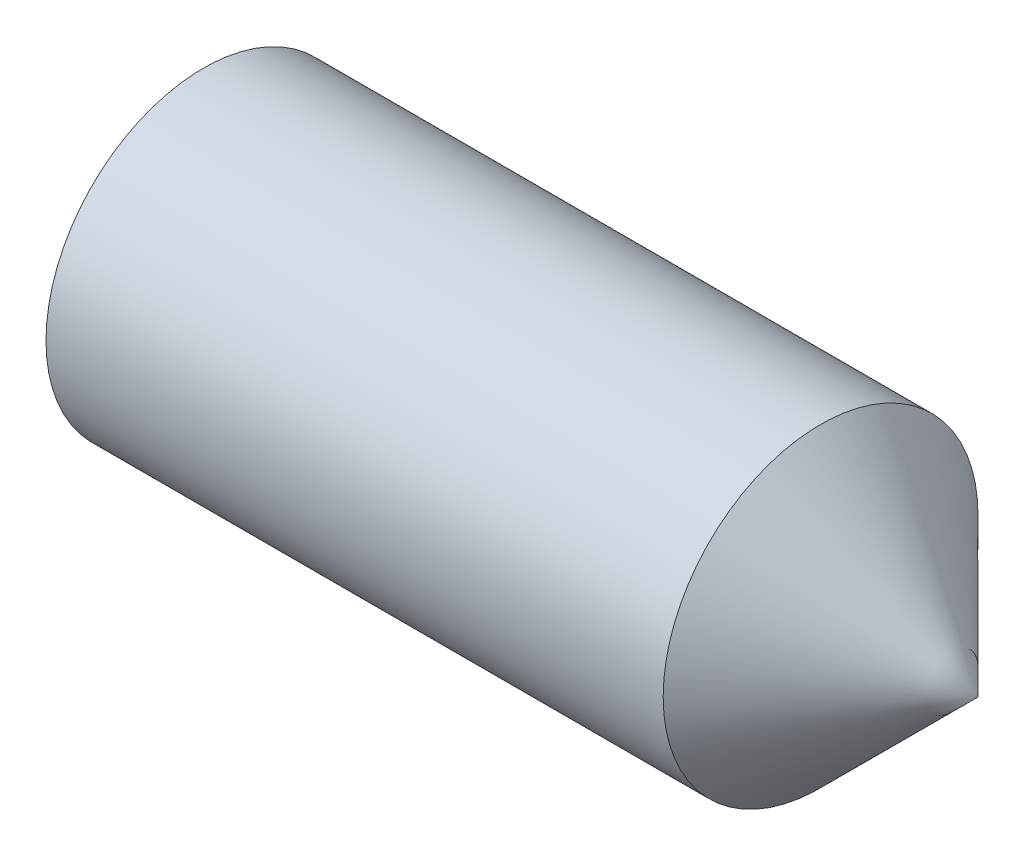
ISO-10303-21;
HEADER;
FILE_DESCRIPTION(('STEP AP214'),'2;1');
FILE_NAME('part.step','',(''),(''),'','','');
FILE_SCHEMA(('AUTOMOTIVE_DESIGN { 1 0 10303 214 1 1 1 1 }'));
ENDSEC;
DATA;
#1=APPLICATION_CONTEXT('core data for automotive mechanical design processes');
#2=APPLICATION_PROTOCOL_DEFINITION('international standard','automotive_design',2000,#1);
#3=PRODUCT_CONTEXT('',#1,'mechanical');
#4=PRODUCT('Part','Part','',(#3));
#5=PRODUCT_RELATED_PRODUCT_CATEGORY('part','',(#4));
#6=PRODUCT_DEFINITION_FORMATION('','',#4);
#7=PRODUCT_DEFINITION_CONTEXT('part definition',#1,'design');
#8=PRODUCT_DEFINITION('design','',#6,#7);
#9=PRODUCT_DEFINITION_SHAPE('','',#8);
#10=(LENGTH_UNIT() NAMED_UNIT(*) SI_UNIT(.MILLI.,.METRE.));
#11=(NAMED_UNIT(*) PLANE_ANGLE_UNIT() SI_UNIT($,.RADIAN.));
#12=(NAMED_UNIT(*) SI_UNIT($,.STERADIAN.) SOLID_ANGLE_UNIT());
#13=UNCERTAINTY_MEASURE_WITH_UNIT(LENGTH_MEASURE(1.E-05),#10,'distance_accuracy_value','');
#14=(GEOMETRIC_REPRESENTATION_CONTEXT(3) GLOBAL_UNCERTAINTY_ASSIGNED_CONTEXT((#13)) GLOBAL_UNIT_ASSIGNED_CONTEXT((#10,
#11,#12)) REPRESENTATION_CONTEXT('',''));
#15=CARTESIAN_POINT('',(0.,0.,0.));
#16=DIRECTION('',(0.,0.,1.));
#17=DIRECTION('',(1.,0.,0.));
#18=AXIS2_PLACEMENT_3D('',#15,#16,#17);
#19=CARTESIAN_POINT('',(0.,0.,0.));
#20=DIRECTION('',(-1.,0.,0.));
#21=DIRECTION('',(0.,0.,1.));
#22=AXIS2_PLACEMENT_3D('',#19,#20,#21);
#23=PLANE('',#22);
#24=CARTESIAN_POINT('',(0.,0.,0.));
#25=DIRECTION('',(-1.,0.,0.));
#26=DIRECTION('',(0.,0.,1.));
#27=AXIS2_PLACEMENT_3D('',#24,#25,#26);
#28=CIRCLE('',#27,10.352);
#29=CARTESIAN_POINT('',(0.,0.,10.352));
#30=VERTEX_POINT('',#29);
#31=EDGE_CURVE('E11',#30,#30,#28,.T.);
#32=ORIENTED_EDGE('',*,*,#31,.T.);
#33=EDGE_LOOP('',(#32));
#34=FACE_BOUND('',#33,.T.);
#35=DIRECTION('',(0.,0.,-1.));
#36=VECTOR('',#35,1.);
#37=CARTESIAN_POINT('',(0.,6.,3.46410161513774));
#38=LINE('',#37,#36);
#39=CARTESIAN_POINT('',(0.,6.,3.46410161513774));
#40=VERTEX_POINT('',#39);
#41=CARTESIAN_POINT('',(0.,6.,-3.46410161513776));
#42=VERTEX_POINT('',#41);
#43=EDGE_CURVE('E96',#40,#42,#38,.T.);
#44=ORIENTED_EDGE('',*,*,#43,.F.);
#45=DIRECTION('',(0.,-0.866025403784438,0.5));
#46=VECTOR('',#45,1.);
#47=CARTESIAN_POINT('',(0.,6.,3.46410161513774));
#48=LINE('',#47,#46);
#49=CARTESIAN_POINT('',(0.,0.,6.9282032302755));
#50=VERTEX_POINT('',#49);
#51=EDGE_CURVE('E49',#40,#50,#48,.T.);
#52=ORIENTED_EDGE('',*,*,#51,.T.);
#53=DIRECTION('',(0.,0.866025403784439,0.5));
#54=VECTOR('',#53,1.);
#55=CARTESIAN_POINT('',(0.,-5.99999999999999,3.46410161513775));
#56=LINE('',#55,#54);
#57=CARTESIAN_POINT('',(0.,-5.99999999999999,3.46410161513775));
#58=VERTEX_POINT('',#57);
#59=EDGE_CURVE('E102',#58,#50,#56,.T.);
#60=ORIENTED_EDGE('',*,*,#59,.F.);
#61=DIRECTION('',(0.,0.,-1.));
#62=VECTOR('',#61,1.);
#63=CARTESIAN_POINT('',(0.,-5.99999999999999,3.46410161513775));
#64=LINE('',#63,#62);
#65=CARTESIAN_POINT('',(0.,-5.99999999999999,-3.46410161513775));
#66=VERTEX_POINT('',#65);
#67=EDGE_CURVE('E122',#58,#66,#64,.T.);
#68=ORIENTED_EDGE('',*,*,#67,.T.);
#69=DIRECTION('',(0.,0.866025403784438,-0.500000000000001));
#70=VECTOR('',#69,1.);
#71=CARTESIAN_POINT('',(0.,-5.99999999999999,-3.46410161513775));
#72=LINE('',#71,#70);
#73=CARTESIAN_POINT('',(0.,0.,-6.92820323027551));
#74=VERTEX_POINT('',#73);
#75=EDGE_CURVE('E125',#66,#74,#72,.T.);
#76=ORIENTED_EDGE('',*,*,#75,.T.);
#77=DIRECTION('',(0.,-0.866025403784439,-0.5));
#78=VECTOR('',#77,1.);
#79=CARTESIAN_POINT('',(0.,6.,-3.46410161513776));
#80=LINE('',#79,#78);
#81=EDGE_CURVE('E128',#42,#74,#80,.T.);
#82=ORIENTED_EDGE('',*,*,#81,.F.);
#83=EDGE_LOOP('',(#44,#52,#60,#68,#76,#82));
#84=FACE_BOUND('',#83,.T.);
#85=ADVANCED_FACE('F35',(#34,#84),#23,.T.);
#86=CARTESIAN_POINT('',(0.,0.,0.));
#87=DIRECTION('',(1.,0.,0.));
#88=DIRECTION('',(0.,0.,-1.));
#89=AXIS2_PLACEMENT_3D('',#86,#87,#88);
#90=CONICAL_SURFACE('',#89,10.352,1.0471975511966);
#91=CARTESIAN_POINT('',(0.951473243624497,0.,0.));
#92=DIRECTION('',(-1.,0.,0.));
#93=DIRECTION('',(0.,0.,1.));
#94=AXIS2_PLACEMENT_3D('',#91,#92,#93);
#95=CIRCLE('',#94,12.);
#96=CARTESIAN_POINT('',(0.951473243624497,0.,12.));
#97=VERTEX_POINT('',#96);
#98=EDGE_CURVE('E42',#97,#97,#95,.T.);
#99=ORIENTED_EDGE('',*,*,#98,.T.);
#100=EDGE_LOOP('',(#99));
#101=FACE_BOUND('',#100,.T.);
#102=ORIENTED_EDGE('',*,*,#31,.F.);
#103=EDGE_LOOP('',(#102));
#104=FACE_BOUND('',#103,.T.);
#105=ADVANCED_FACE('F145',(#101,#104),#90,.T.);
#106=CARTESIAN_POINT('',(-12.7,0.,0.));
#107=DIRECTION('',(-1.,0.,0.));
#108=DIRECTION('',(0.,0.,1.));
#109=AXIS2_PLACEMENT_3D('',#106,#107,#108);
#110=CYLINDRICAL_SURFACE('',#109,12.);
#111=CARTESIAN_POINT('',(48.,0.,0.));
#112=DIRECTION('',(-1.,0.,0.));
#113=DIRECTION('',(0.,0.,1.));
#114=AXIS2_PLACEMENT_3D('',#111,#112,#113);
#115=CIRCLE('',#114,12.);
#116=CARTESIAN_POINT('',(48.,0.,12.));
#117=VERTEX_POINT('',#116);
#118=EDGE_CURVE('E103',#117,#117,#115,.T.);
#119=ORIENTED_EDGE('',*,*,#118,.T.);
#120=EDGE_LOOP('',(#119));
#121=FACE_BOUND('',#120,.T.);
#122=ORIENTED_EDGE('',*,*,#98,.F.);
#123=EDGE_LOOP('',(#122));
#124=FACE_BOUND('',#123,.T.);
#125=ADVANCED_FACE('F148',(#121,#124),#110,.T.);
#126=CARTESIAN_POINT('',(48.,0.,0.));
#127=DIRECTION('',(-1.,0.,0.));
#128=DIRECTION('',(0.,0.,1.));
#129=AXIS2_PLACEMENT_3D('',#126,#127,#128);
#130=CONICAL_SURFACE('',#129,12.,0.78539816339745);
#131=CARTESIAN_POINT('',(60.,0.,0.));
#132=VERTEX_POINT('',#131);
#133=VERTEX_LOOP('',#132);
#134=FACE_BOUND('',#133,.T.);
#135=ORIENTED_EDGE('',*,*,#118,.F.);
#136=EDGE_LOOP('',(#135));
#137=FACE_BOUND('',#136,.T.);
#138=ADVANCED_FACE('F150',(#134,#137),#130,.T.);
#139=CARTESIAN_POINT('',(15.,6.,3.46410161513774));
#140=DIRECTION('',(0.,-0.5,-0.866025403784438));
#141=DIRECTION('',(0.,0.866025403784438,-0.5));
#142=AXIS2_PLACEMENT_3D('',#139,#140,#141);
#143=PLANE('',#142);
#144=ORIENTED_EDGE('',*,*,#51,.F.);
#145=DIRECTION('',(-1.,0.,0.));
#146=VECTOR('',#145,1.);
#147=CARTESIAN_POINT('',(15.,6.,3.46410161513774));
#148=LINE('',#147,#146);
#149=CARTESIAN_POINT('',(15.,6.,3.46410161513774));
#150=VERTEX_POINT('',#149);
#151=EDGE_CURVE('E90',#150,#40,#148,.T.);
#152=ORIENTED_EDGE('',*,*,#151,.F.);
#153=DIRECTION('',(0.,-0.866025403784438,0.5));
#154=VECTOR('',#153,1.);
#155=CARTESIAN_POINT('',(15.,6.,3.46410161513774));
#156=LINE('',#155,#154);
#157=CARTESIAN_POINT('',(15.,0.,6.9282032302755));
#158=VERTEX_POINT('',#157);
#159=EDGE_CURVE('E85',#150,#158,#156,.T.);
#160=ORIENTED_EDGE('',*,*,#159,.T.);
#161=DIRECTION('',(-1.,0.,0.));
#162=VECTOR('',#161,1.);
#163=CARTESIAN_POINT('',(15.,0.,6.9282032302755));
#164=LINE('',#163,#162);
#165=EDGE_CURVE('E88',#158,#50,#164,.T.);
#166=ORIENTED_EDGE('',*,*,#165,.T.);
#167=EDGE_LOOP('',(#144,#152,#160,#166));
#168=FACE_BOUND('',#167,.T.);
#169=ADVANCED_FACE('F87',(#168),#143,.T.);
#170=CARTESIAN_POINT('',(15.,-5.99999999999999,3.46410161513775));
#171=DIRECTION('',(0.,-0.5,0.866025403784439));
#172=DIRECTION('',(0.,-0.866025403784439,-0.5));
#173=AXIS2_PLACEMENT_3D('',#170,#171,#172);
#174=PLANE('',#173);
#175=ORIENTED_EDGE('',*,*,#59,.T.);
#176=ORIENTED_EDGE('',*,*,#165,.F.);
#177=DIRECTION('',(0.,0.866025403784439,0.5));
#178=VECTOR('',#177,1.);
#179=CARTESIAN_POINT('',(15.,-5.99999999999999,3.46410161513775));
#180=LINE('',#179,#178);
#181=CARTESIAN_POINT('',(15.,-5.99999999999999,3.46410161513775));
#182=VERTEX_POINT('',#181);
#183=EDGE_CURVE('E95',#182,#158,#180,.T.);
#184=ORIENTED_EDGE('',*,*,#183,.F.);
#185=DIRECTION('',(-1.,0.,0.));
#186=VECTOR('',#185,1.);
#187=CARTESIAN_POINT('',(15.,-5.99999999999999,3.46410161513775));
#188=LINE('',#187,#186);
#189=EDGE_CURVE('E104',#182,#58,#188,.T.);
#190=ORIENTED_EDGE('',*,*,#189,.T.);
#191=EDGE_LOOP('',(#175,#176,#184,#190));
#192=FACE_BOUND('',#191,.T.);
#193=ADVANCED_FACE('F100',(#192),#174,.F.);
#194=CARTESIAN_POINT('',(15.,-5.99999999999999,3.46410161513775));
#195=DIRECTION('',(0.,1.,0.));
#196=DIRECTION('',(0.,0.,1.));
#197=AXIS2_PLACEMENT_3D('',#194,#195,#196);
#198=PLANE('',#197);
#199=ORIENTED_EDGE('',*,*,#67,.F.);
#200=ORIENTED_EDGE('',*,*,#189,.F.);
#201=DIRECTION('',(0.,0.,-1.));
#202=VECTOR('',#201,1.);
#203=CARTESIAN_POINT('',(15.,-5.99999999999999,3.46410161513775));
#204=LINE('',#203,#202);
#205=CARTESIAN_POINT('',(15.,-5.99999999999999,-3.46410161513775));
#206=VERTEX_POINT('',#205);
#207=EDGE_CURVE('E109',#182,#206,#204,.T.);
#208=ORIENTED_EDGE('',*,*,#207,.T.);
#209=DIRECTION('',(-1.,0.,0.));
#210=VECTOR('',#209,1.);
#211=CARTESIAN_POINT('',(15.,-5.99999999999999,-3.46410161513775));
#212=LINE('',#211,#210);
#213=EDGE_CURVE('E138',#206,#66,#212,.T.);
#214=ORIENTED_EDGE('',*,*,#213,.T.);
#215=EDGE_LOOP('',(#199,#200,#208,#214));
#216=FACE_BOUND('',#215,.T.);
#217=ADVANCED_FACE('F178',(#216),#198,.T.);
#218=CARTESIAN_POINT('',(15.,-5.99999999999999,-3.46410161513775));
#219=DIRECTION('',(0.,0.500000000000001,0.866025403784438));
#220=DIRECTION('',(0.,-0.866025403784438,0.500000000000001));
#221=AXIS2_PLACEMENT_3D('',#218,#219,#220);
#222=PLANE('',#221);
#223=ORIENTED_EDGE('',*,*,#75,.F.);
#224=ORIENTED_EDGE('',*,*,#213,.F.);
#225=DIRECTION('',(0.,0.866025403784438,-0.500000000000001));
#226=VECTOR('',#225,1.);
#227=CARTESIAN_POINT('',(15.,-5.99999999999999,-3.46410161513775));
#228=LINE('',#227,#226);
#229=CARTESIAN_POINT('',(15.,0.,-6.92820323027551));
#230=VERTEX_POINT('',#229);
#231=EDGE_CURVE('E111',#206,#230,#228,.T.);
#232=ORIENTED_EDGE('',*,*,#231,.T.);
#233=DIRECTION('',(-1.,0.,0.));
#234=VECTOR('',#233,1.);
#235=CARTESIAN_POINT('',(15.,0.,-6.92820323027551));
#236=LINE('',#235,#234);
#237=EDGE_CURVE('E136',#230,#74,#236,.T.);
#238=ORIENTED_EDGE('',*,*,#237,.T.);
#239=EDGE_LOOP('',(#223,#224,#232,#238));
#240=FACE_BOUND('',#239,.T.);
#241=ADVANCED_FACE('F174',(#240),#222,.T.);
#242=CARTESIAN_POINT('',(15.,6.,-3.46410161513776));
#243=DIRECTION('',(0.,0.5,-0.866025403784439));
#244=DIRECTION('',(0.,0.866025403784439,0.5));
#245=AXIS2_PLACEMENT_3D('',#242,#243,#244);
#246=PLANE('',#245);
#247=ORIENTED_EDGE('',*,*,#81,.T.);
#248=ORIENTED_EDGE('',*,*,#237,.F.);
#249=DIRECTION('',(0.,-0.866025403784439,-0.5));
#250=VECTOR('',#249,1.);
#251=CARTESIAN_POINT('',(15.,6.,-3.46410161513776));
#252=LINE('',#251,#250);
#253=CARTESIAN_POINT('',(15.,6.,-3.46410161513776));
#254=VERTEX_POINT('',#253);
#255=EDGE_CURVE('E115',#254,#230,#252,.T.);
#256=ORIENTED_EDGE('',*,*,#255,.F.);
#257=DIRECTION('',(-1.,0.,0.));
#258=VECTOR('',#257,1.);
#259=CARTESIAN_POINT('',(15.,6.,-3.46410161513776));
#260=LINE('',#259,#258);
#261=EDGE_CURVE('E134',#254,#42,#260,.T.);
#262=ORIENTED_EDGE('',*,*,#261,.T.);
#263=EDGE_LOOP('',(#247,#248,#256,#262));
#264=FACE_BOUND('',#263,.T.);
#265=ADVANCED_FACE('F171',(#264),#246,.F.);
#266=CARTESIAN_POINT('',(15.,6.,3.46410161513774));
#267=DIRECTION('',(0.,1.,0.));
#268=DIRECTION('',(0.,0.,1.));
#269=AXIS2_PLACEMENT_3D('',#266,#267,#268);
#270=PLANE('',#269);
#271=ORIENTED_EDGE('',*,*,#43,.T.);
#272=ORIENTED_EDGE('',*,*,#261,.F.);
#273=DIRECTION('',(0.,0.,-1.));
#274=VECTOR('',#273,1.);
#275=CARTESIAN_POINT('',(15.,6.,3.46410161513774));
#276=LINE('',#275,#274);
#277=EDGE_CURVE('E118',#150,#254,#276,.T.);
#278=ORIENTED_EDGE('',*,*,#277,.F.);
#279=ORIENTED_EDGE('',*,*,#151,.T.);
#280=EDGE_LOOP('',(#271,#272,#278,#279));
#281=FACE_BOUND('',#280,.T.);
#282=ADVANCED_FACE('F167',(#281),#270,.F.);
#283=CARTESIAN_POINT('',(15.,12.,0.));
#284=DIRECTION('',(1.,0.,0.));
#285=DIRECTION('',(0.,0.,-1.));
#286=AXIS2_PLACEMENT_3D('',#283,#284,#285);
#287=PLANE('',#286);
#288=ORIENTED_EDGE('',*,*,#159,.F.);
#289=ORIENTED_EDGE('',*,*,#277,.T.);
#290=ORIENTED_EDGE('',*,*,#255,.T.);
#291=ORIENTED_EDGE('',*,*,#231,.F.);
#292=ORIENTED_EDGE('',*,*,#207,.F.);
#293=ORIENTED_EDGE('',*,*,#183,.T.);
#294=EDGE_LOOP('',(#288,#289,#290,#291,#292,#293));
#295=FACE_BOUND('',#294,.T.);
#296=ADVANCED_FACE('F107',(#295),#287,.F.);
#297=CLOSED_SHELL('',(#85,#105,#125,#138,#169,#193,#217,#241,#265,#282,#296));
#298=MANIFOLD_SOLID_BREP('B2',#297);
#299=ADVANCED_BREP_SHAPE_REPRESENTATION('',(#18,#298),#14);
#300=SHAPE_DEFINITION_REPRESENTATION(#9,#299);
ENDSEC;
END-ISO-10303-21;
